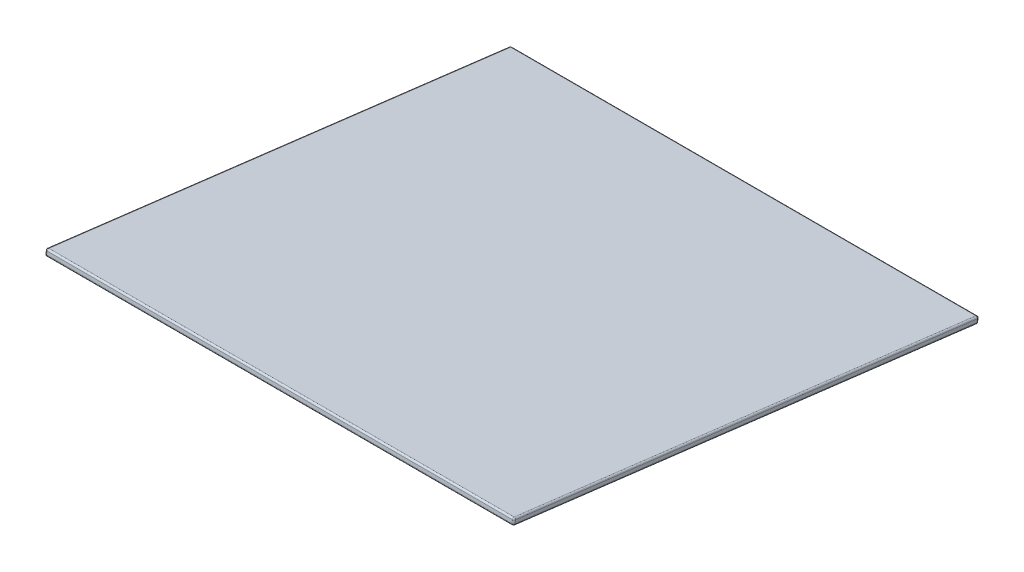
ISO-10303-21;
HEADER;
FILE_DESCRIPTION(('STEP AP214'),'2;1');
FILE_NAME('part.step','',(''),(''),'','','');
FILE_SCHEMA(('AUTOMOTIVE_DESIGN { 1 0 10303 214 1 1 1 1 }'));
ENDSEC;
DATA;
#1=APPLICATION_CONTEXT('core data for automotive mechanical design processes');
#2=APPLICATION_PROTOCOL_DEFINITION('international standard','automotive_design',2000,#1);
#3=PRODUCT_CONTEXT('',#1,'mechanical');
#4=PRODUCT('Part','Part','',(#3));
#5=PRODUCT_RELATED_PRODUCT_CATEGORY('part','',(#4));
#6=PRODUCT_DEFINITION_FORMATION('','',#4);
#7=PRODUCT_DEFINITION_CONTEXT('part definition',#1,'design');
#8=PRODUCT_DEFINITION('design','',#6,#7);
#9=PRODUCT_DEFINITION_SHAPE('','',#8);
#10=(LENGTH_UNIT() NAMED_UNIT(*) SI_UNIT(.MILLI.,.METRE.));
#11=(NAMED_UNIT(*) PLANE_ANGLE_UNIT() SI_UNIT($,.RADIAN.));
#12=(NAMED_UNIT(*) SI_UNIT($,.STERADIAN.) SOLID_ANGLE_UNIT());
#13=UNCERTAINTY_MEASURE_WITH_UNIT(LENGTH_MEASURE(1.E-05),#10,'distance_accuracy_value','');
#14=(GEOMETRIC_REPRESENTATION_CONTEXT(3) GLOBAL_UNCERTAINTY_ASSIGNED_CONTEXT((#13)) GLOBAL_UNIT_ASSIGNED_CONTEXT((#10,
#11,#12)) REPRESENTATION_CONTEXT('',''));
#15=CARTESIAN_POINT('',(0.,0.,0.));
#16=DIRECTION('',(0.,0.,1.));
#17=DIRECTION('',(1.,0.,0.));
#18=AXIS2_PLACEMENT_3D('',#15,#16,#17);
#19=CARTESIAN_POINT('',(72.5,-11.5000570562289,-71.6324328897591));
#20=DIRECTION('',(1.,0.,0.));
#21=DIRECTION('',(0.,0.,-1.));
#22=AXIS2_PLACEMENT_3D('',#19,#20,#21);
#23=PLANE('',#22);
#24=DIRECTION('',(0.,-0.992546151641323,0.121869343405141));
#25=VECTOR('',#24,1.);
#26=CARTESIAN_POINT('',(72.5,-11.4391223845263,-71.1361598139385));
#27=LINE('',#26,#25);
#28=CARTESIAN_POINT('',(72.5,-12.9279416119883,-70.9533557988308));
#29=VERTEX_POINT('',#28);
#30=CARTESIAN_POINT('',(72.5,-11.935395460347,-71.0752251422359));
#31=VERTEX_POINT('',#30);
#32=EDGE_CURVE('E219',#29,#31,#27,.F.);
#33=ORIENTED_EDGE('',*,*,#32,.T.);
#34=DIRECTION('',(0.,0.121869343405141,0.992546151641323));
#35=VECTOR('',#34,1.);
#36=CARTESIAN_POINT('',(72.5,5.67472466169586,72.3476937699352));
#37=LINE('',#36,#35);
#38=CARTESIAN_POINT('',(72.5,5.61378998999329,71.8514206941146));
#39=VERTEX_POINT('',#38);
#40=EDGE_CURVE('E222',#31,#39,#37,.T.);
#41=ORIENTED_EDGE('',*,*,#40,.T.);
#42=DIRECTION('',(0.,-0.992546151641323,0.121869343405141));
#43=VECTOR('',#42,1.);
#44=CARTESIAN_POINT('',(72.5,6.11006306581395,71.790486022412));
#45=LINE('',#44,#43);
#46=CARTESIAN_POINT('',(72.5,4.62124383835196,71.9732900375197));
#47=VERTEX_POINT('',#46);
#48=EDGE_CURVE('E220',#39,#47,#45,.T.);
#49=ORIENTED_EDGE('',*,*,#48,.T.);
#50=DIRECTION('',(0.,0.121869343405141,0.992546151641323));
#51=VECTOR('',#50,1.);
#52=CARTESIAN_POINT('',(72.5,-12.9888762836909,-71.4496288746514));
#53=LINE('',#52,#51);
#54=EDGE_CURVE('E216',#47,#29,#53,.F.);
#55=ORIENTED_EDGE('',*,*,#54,.T.);
#56=EDGE_LOOP('',(#33,#41,#49,#55));
#57=FACE_BOUND('',#56,.T.);
#58=ADVANCED_FACE('F37',(#57),#23,.T.);
#59=CARTESIAN_POINT('',(72.5,-11.5000570562289,-71.6324328897591));
#60=DIRECTION('',(0.,0.121869343405141,0.992546151641323));
#61=DIRECTION('',(0.,-0.992546151641323,0.121869343405141));
#62=AXIS2_PLACEMENT_3D('',#59,#60,#61);
#63=PLANE('',#62);
#64=DIRECTION('',(-1.,0.,0.));
#65=VECTOR('',#64,1.);
#66=CARTESIAN_POINT('',(72.5,-11.9963301320496,-71.5714982180566));
#67=LINE('',#66,#65);
#68=CARTESIAN_POINT('',(-72.,-11.9963301320496,-71.5714982180566));
#69=VERTEX_POINT('',#68);
#70=CARTESIAN_POINT('',(72.,-11.9963301320496,-71.5714982180566));
#71=VERTEX_POINT('',#70);
#72=EDGE_CURVE('E269',#69,#71,#67,.F.);
#73=ORIENTED_EDGE('',*,*,#72,.T.);
#74=DIRECTION('',(0.,-0.992546151641323,0.121869343405141));
#75=VECTOR('',#74,1.);
#76=CARTESIAN_POINT('',(72.,-13.4851493595115,-71.3886942029489));
#77=LINE('',#76,#75);
#78=CARTESIAN_POINT('',(72.,-12.9888762836909,-71.4496288746514));
#79=VERTEX_POINT('',#78);
#80=EDGE_CURVE('E263',#71,#79,#77,.T.);
#81=ORIENTED_EDGE('',*,*,#80,.T.);
#82=DIRECTION('',(-1.,0.,0.));
#83=VECTOR('',#82,1.);
#84=CARTESIAN_POINT('',(-72.5,-12.9888762836909,-71.4496288746514));
#85=LINE('',#84,#83);
#86=CARTESIAN_POINT('',(-72.,-12.9888762836909,-71.4496288746514));
#87=VERTEX_POINT('',#86);
#88=EDGE_CURVE('E278',#79,#87,#85,.T.);
#89=ORIENTED_EDGE('',*,*,#88,.T.);
#90=DIRECTION('',(0.,-0.992546151641323,0.121869343405141));
#91=VECTOR('',#90,1.);
#92=CARTESIAN_POINT('',(-72.,-11.5000570562289,-71.6324328897591));
#93=LINE('',#92,#91);
#94=EDGE_CURVE('E274',#87,#69,#93,.F.);
#95=ORIENTED_EDGE('',*,*,#94,.T.);
#96=EDGE_LOOP('',(#73,#81,#89,#95));
#97=FACE_BOUND('',#96,.T.);
#98=ADVANCED_FACE('F272',(#97),#63,.F.);
#99=CARTESIAN_POINT('',(-72.5,-11.5000570562289,-71.6324328897591));
#100=DIRECTION('',(1.,0.,0.));
#101=DIRECTION('',(0.,0.,-1.));
#102=AXIS2_PLACEMENT_3D('',#99,#100,#101);
#103=PLANE('',#102);
#104=DIRECTION('',(0.,0.121869343405141,0.992546151641323));
#105=VECTOR('',#104,1.);
#106=CARTESIAN_POINT('',(-72.5,-11.9963301320496,-71.5714982180566));
#107=LINE('',#106,#105);
#108=CARTESIAN_POINT('',(-72.5,5.61378998999329,71.8514206941146));
#109=VERTEX_POINT('',#108);
#110=CARTESIAN_POINT('',(-72.5,-11.935395460347,-71.0752251422359));
#111=VERTEX_POINT('',#110);
#112=EDGE_CURVE('E156',#109,#111,#107,.F.);
#113=ORIENTED_EDGE('',*,*,#112,.T.);
#114=DIRECTION('',(0.,-0.992546151641323,0.121869343405141));
#115=VECTOR('',#114,1.);
#116=CARTESIAN_POINT('',(-72.5,-11.4391223845263,-71.1361598139385));
#117=LINE('',#116,#115);
#118=CARTESIAN_POINT('',(-72.5,-12.9279416119883,-70.9533557988307));
#119=VERTEX_POINT('',#118);
#120=EDGE_CURVE('E235',#111,#119,#117,.T.);
#121=ORIENTED_EDGE('',*,*,#120,.T.);
#122=DIRECTION('',(0.,0.121869343405141,0.992546151641323));
#123=VECTOR('',#122,1.);
#124=CARTESIAN_POINT('',(-72.5,4.68217851005454,72.4695631133404));
#125=LINE('',#124,#123);
#126=CARTESIAN_POINT('',(-72.5,4.62124383835197,71.9732900375198));
#127=VERTEX_POINT('',#126);
#128=EDGE_CURVE('E232',#119,#127,#125,.T.);
#129=ORIENTED_EDGE('',*,*,#128,.T.);
#130=DIRECTION('',(0.,-0.992546151641323,0.121869343405141));
#131=VECTOR('',#130,1.);
#132=CARTESIAN_POINT('',(-72.5,6.11006306581395,71.790486022412));
#133=LINE('',#132,#131);
#134=EDGE_CURVE('E230',#127,#109,#133,.F.);
#135=ORIENTED_EDGE('',*,*,#134,.T.);
#136=EDGE_LOOP('',(#113,#121,#129,#135));
#137=FACE_BOUND('',#136,.T.);
#138=ADVANCED_FACE('F331',(#137),#103,.F.);
#139=CARTESIAN_POINT('',(72.5,6.17099773751652,72.2867590982327));
#140=DIRECTION('',(0.,0.121869343405141,0.992546151641323));
#141=DIRECTION('',(0.,-0.992546151641323,0.121869343405141));
#142=AXIS2_PLACEMENT_3D('',#139,#140,#141);
#143=PLANE('',#142);
#144=DIRECTION('',(-1.,0.,0.));
#145=VECTOR('',#144,1.);
#146=CARTESIAN_POINT('',(-72.5,5.67472466169586,72.3476937699353));
#147=LINE('',#146,#145);
#148=CARTESIAN_POINT('',(72.,5.67472466169586,72.3476937699352));
#149=VERTEX_POINT('',#148);
#150=CARTESIAN_POINT('',(-72.,5.67472466169586,72.3476937699353));
#151=VERTEX_POINT('',#150);
#152=EDGE_CURVE('E46',#149,#151,#147,.T.);
#153=ORIENTED_EDGE('',*,*,#152,.T.);
#154=DIRECTION('',(0.,-0.992546151641323,0.121869343405141));
#155=VECTOR('',#154,1.);
#156=CARTESIAN_POINT('',(-72.,4.18590543423387,72.530497785043));
#157=LINE('',#156,#155);
#158=CARTESIAN_POINT('',(-72.,4.68217851005454,72.4695631133404));
#159=VERTEX_POINT('',#158);
#160=EDGE_CURVE('E11',#151,#159,#157,.T.);
#161=ORIENTED_EDGE('',*,*,#160,.T.);
#162=DIRECTION('',(-1.,0.,0.));
#163=VECTOR('',#162,1.);
#164=CARTESIAN_POINT('',(72.5,4.68217851005453,72.4695631133404));
#165=LINE('',#164,#163);
#166=CARTESIAN_POINT('',(72.,4.68217851005453,72.4695631133404));
#167=VERTEX_POINT('',#166);
#168=EDGE_CURVE('E238',#159,#167,#165,.F.);
#169=ORIENTED_EDGE('',*,*,#168,.T.);
#170=DIRECTION('',(0.,-0.992546151641323,0.121869343405141));
#171=VECTOR('',#170,1.);
#172=CARTESIAN_POINT('',(72.,6.17099773751652,72.2867590982327));
#173=LINE('',#172,#171);
#174=EDGE_CURVE('E57',#167,#149,#173,.F.);
#175=ORIENTED_EDGE('',*,*,#174,.T.);
#176=EDGE_LOOP('',(#153,#161,#169,#175));
#177=FACE_BOUND('',#176,.T.);
#178=ADVANCED_FACE('F335',(#177),#143,.T.);
#179=CARTESIAN_POINT('',(0.,-2.66452965935618,0.327163104236797));
#180=DIRECTION('',(0.,-0.992546151641323,0.121869343405141));
#181=DIRECTION('',(0.,-0.121869343405141,-0.992546151641323));
#182=AXIS2_PLACEMENT_3D('',#179,#180,#181);
#183=PLANE('',#182);
#184=DIRECTION('',(0.,0.121869343405141,0.992546151641323));
#185=VECTOR('',#184,1.);
#186=CARTESIAN_POINT('',(72.,-11.5000570562289,-71.6324328897591));
#187=LINE('',#186,#185);
#188=CARTESIAN_POINT('',(72.,6.11006306581395,71.790486022412));
#189=VERTEX_POINT('',#188);
#190=CARTESIAN_POINT('',(72.,-11.4391223845263,-71.1361598139385));
#191=VERTEX_POINT('',#190);
#192=EDGE_CURVE('E135',#189,#191,#187,.F.);
#193=ORIENTED_EDGE('',*,*,#192,.T.);
#194=DIRECTION('',(-1.,0.,0.));
#195=VECTOR('',#194,1.);
#196=CARTESIAN_POINT('',(0.,-11.4391223845263,-71.1361598139385));
#197=LINE('',#196,#195);
#198=CARTESIAN_POINT('',(-72.,-11.4391223845263,-71.1361598139385));
#199=VERTEX_POINT('',#198);
#200=EDGE_CURVE('E131',#191,#199,#197,.T.);
#201=ORIENTED_EDGE('',*,*,#200,.T.);
#202=DIRECTION('',(0.,0.121869343405141,0.992546151641323));
#203=VECTOR('',#202,1.);
#204=CARTESIAN_POINT('',(-72.,-2.66452965935618,0.327163104236803));
#205=LINE('',#204,#203);
#206=CARTESIAN_POINT('',(-72.,6.11006306581395,71.790486022412));
#207=VERTEX_POINT('',#206);
#208=EDGE_CURVE('E125',#199,#207,#205,.T.);
#209=ORIENTED_EDGE('',*,*,#208,.T.);
#210=DIRECTION('',(-1.,0.,0.));
#211=VECTOR('',#210,1.);
#212=CARTESIAN_POINT('',(72.5,6.11006306581395,71.790486022412));
#213=LINE('',#212,#211);
#214=EDGE_CURVE('E128',#207,#189,#213,.F.);
#215=ORIENTED_EDGE('',*,*,#214,.T.);
#216=EDGE_LOOP('',(#193,#201,#209,#215));
#217=FACE_BOUND('',#216,.T.);
#218=ADVANCED_FACE('F127',(#217),#183,.F.);
#219=CARTESIAN_POINT('',(0.,-4.64962196263883,0.570901791047078));
#220=DIRECTION('',(0.,-0.992546151641323,0.121869343405141));
#221=DIRECTION('',(0.,-0.121869343405141,-0.992546151641323));
#222=AXIS2_PLACEMENT_3D('',#219,#220,#221);
#223=PLANE('',#222);
#224=DIRECTION('',(0.,0.121869343405141,0.992546151641323));
#225=VECTOR('',#224,1.);
#226=CARTESIAN_POINT('',(-72.,-13.4851493595115,-71.3886942029488));
#227=LINE('',#226,#225);
#228=CARTESIAN_POINT('',(-72.,4.12497076253131,72.0342247092223));
#229=VERTEX_POINT('',#228);
#230=CARTESIAN_POINT('',(-72.,-13.424214687809,-70.8924211271282));
#231=VERTEX_POINT('',#230);
#232=EDGE_CURVE('E284',#229,#231,#227,.F.);
#233=ORIENTED_EDGE('',*,*,#232,.T.);
#234=DIRECTION('',(-1.,0.,0.));
#235=VECTOR('',#234,1.);
#236=CARTESIAN_POINT('',(72.5,-13.424214687809,-70.8924211271282));
#237=LINE('',#236,#235);
#238=CARTESIAN_POINT('',(72.,-13.424214687809,-70.8924211271282));
#239=VERTEX_POINT('',#238);
#240=EDGE_CURVE('E224',#231,#239,#237,.F.);
#241=ORIENTED_EDGE('',*,*,#240,.T.);
#242=DIRECTION('',(0.,0.121869343405141,0.992546151641323));
#243=VECTOR('',#242,1.);
#244=CARTESIAN_POINT('',(72.,-4.64962196263883,0.570901791047071));
#245=LINE('',#244,#243);
#246=CARTESIAN_POINT('',(72.,4.1249707625313,72.0342247092223));
#247=VERTEX_POINT('',#246);
#248=EDGE_CURVE('E214',#239,#247,#245,.T.);
#249=ORIENTED_EDGE('',*,*,#248,.T.);
#250=DIRECTION('',(-1.,0.,0.));
#251=VECTOR('',#250,1.);
#252=CARTESIAN_POINT('',(0.,4.1249707625313,72.0342247092223));
#253=LINE('',#252,#251);
#254=EDGE_CURVE('E268',#247,#229,#253,.T.);
#255=ORIENTED_EDGE('',*,*,#254,.T.);
#256=EDGE_LOOP('',(#233,#241,#249,#255));
#257=FACE_BOUND('',#256,.T.);
#258=ADVANCED_FACE('F288',(#257),#223,.T.);
#259=CARTESIAN_POINT('',(0.,4.62124383835197,71.9732900375197));
#260=DIRECTION('',(-1.,0.,0.));
#261=DIRECTION('',(0.,0.,1.));
#262=AXIS2_PLACEMENT_3D('',#259,#260,#261);
#263=CYLINDRICAL_SURFACE('',#262,0.5);
#264=CARTESIAN_POINT('',(72.,4.62124383835196,71.9732900375197));
#265=DIRECTION('',(1.,0.,0.));
#266=DIRECTION('',(0.,1.,0.));
#267=AXIS2_PLACEMENT_3D('',#264,#265,#266);
#268=CIRCLE('',#267,0.5);
#269=EDGE_CURVE('E41',#167,#247,#268,.T.);
#270=ORIENTED_EDGE('',*,*,#269,.F.);
#271=ORIENTED_EDGE('',*,*,#168,.F.);
#272=CARTESIAN_POINT('',(-72.,4.62124383835197,71.9732900375198));
#273=DIRECTION('',(-1.,0.,0.));
#274=DIRECTION('',(0.,0.,1.));
#275=AXIS2_PLACEMENT_3D('',#272,#273,#274);
#276=CIRCLE('',#275,0.5);
#277=EDGE_CURVE('E194',#229,#159,#276,.T.);
#278=ORIENTED_EDGE('',*,*,#277,.F.);
#279=ORIENTED_EDGE('',*,*,#254,.F.);
#280=EDGE_LOOP('',(#270,#271,#278,#279));
#281=FACE_BOUND('',#280,.T.);
#282=ADVANCED_FACE('F39',(#281),#263,.T.);
#283=CARTESIAN_POINT('',(72.,4.62124383835196,71.9732900375197));
#284=DIRECTION('',(0.,-0.992546151641324,0.121869343405135));
#285=DIRECTION('',(0.,-0.121869343405135,-0.992546151641324));
#286=AXIS2_PLACEMENT_3D('',#283,#284,#285);
#287=SPHERICAL_SURFACE('',#286,0.5);
#288=CARTESIAN_POINT('',(72.,4.62124383835196,71.9732900375197));
#289=DIRECTION('',(0.,-0.992546151641323,0.121869343405138));
#290=DIRECTION('',(0.,-0.121869343405138,-0.992546151641323));
#291=AXIS2_PLACEMENT_3D('',#288,#289,#290);
#292=CIRCLE('',#291,0.5);
#293=EDGE_CURVE('E189',#167,#47,#292,.F.);
#294=ORIENTED_EDGE('',*,*,#293,.F.);
#295=ORIENTED_EDGE('',*,*,#269,.T.);
#296=CARTESIAN_POINT('',(72.,4.62124383835196,71.9732900375197));
#297=DIRECTION('',(0.,0.121869343405134,0.992546151641324));
#298=DIRECTION('',(0.,-0.992546151641324,0.121869343405134));
#299=AXIS2_PLACEMENT_3D('',#296,#297,#298);
#300=CIRCLE('',#299,0.5);
#301=EDGE_CURVE('E192',#47,#247,#300,.F.);
#302=ORIENTED_EDGE('',*,*,#301,.F.);
#303=EDGE_LOOP('',(#294,#295,#302));
#304=FACE_BOUND('',#303,.T.);
#305=ADVANCED_FACE('F206',(#304),#287,.T.);
#306=CARTESIAN_POINT('',(-72.,4.62124383835197,71.9732900375198));
#307=DIRECTION('',(0.,0.121869343405136,0.992546151641323));
#308=DIRECTION('',(0.,-0.992546151641324,0.121869343405136));
#309=AXIS2_PLACEMENT_3D('',#306,#307,#308);
#310=SPHERICAL_SURFACE('',#309,0.5);
#311=CARTESIAN_POINT('',(-72.,4.62124383835197,71.9732900375198));
#312=DIRECTION('',(0.,0.121869343405134,0.992546151641324));
#313=DIRECTION('',(0.,-0.992546151641324,0.121869343405134));
#314=AXIS2_PLACEMENT_3D('',#311,#312,#313);
#315=CIRCLE('',#314,0.5);
#316=EDGE_CURVE('E184',#229,#127,#315,.F.);
#317=ORIENTED_EDGE('',*,*,#316,.F.);
#318=ORIENTED_EDGE('',*,*,#277,.T.);
#319=CARTESIAN_POINT('',(-72.,4.62124383835196,71.9732900375198));
#320=DIRECTION('',(0.,-0.992546151641323,0.121869343405141));
#321=DIRECTION('',(0.,-0.121869343405141,-0.992546151641323));
#322=AXIS2_PLACEMENT_3D('',#319,#320,#321);
#323=CIRCLE('',#322,0.5);
#324=EDGE_CURVE('E187',#127,#159,#323,.F.);
#325=ORIENTED_EDGE('',*,*,#324,.F.);
#326=EDGE_LOOP('',(#317,#318,#325));
#327=FACE_BOUND('',#326,.T.);
#328=ADVANCED_FACE('F494',(#327),#310,.T.);
#329=CARTESIAN_POINT('',(72.,-4.15334888681817,0.509967119344501));
#330=DIRECTION('',(0.,0.121869343405141,0.992546151641323));
#331=DIRECTION('',(0.,-0.992546151641323,0.121869343405141));
#332=AXIS2_PLACEMENT_3D('',#329,#330,#331);
#333=CYLINDRICAL_SURFACE('',#332,0.5);
#334=ORIENTED_EDGE('',*,*,#301,.T.);
#335=ORIENTED_EDGE('',*,*,#248,.F.);
#336=CARTESIAN_POINT('',(72.,-12.9279416119883,-70.9533557988308));
#337=DIRECTION('',(0.,-0.121869343405135,-0.992546151641324));
#338=DIRECTION('',(0.,0.992546151641324,-0.121869343405135));
#339=AXIS2_PLACEMENT_3D('',#336,#337,#338);
#340=CIRCLE('',#339,0.5);
#341=EDGE_CURVE('E179',#29,#239,#340,.T.);
#342=ORIENTED_EDGE('',*,*,#341,.F.);
#343=ORIENTED_EDGE('',*,*,#54,.F.);
#344=EDGE_LOOP('',(#334,#335,#342,#343));
#345=FACE_BOUND('',#344,.T.);
#346=ADVANCED_FACE('F212',(#345),#333,.T.);
#347=CARTESIAN_POINT('',(72.,6.11006306581395,71.790486022412));
#348=DIRECTION('',(0.,-0.992546151641323,0.121869343405141));
#349=DIRECTION('',(0.,-0.121869343405141,-0.992546151641323));
#350=AXIS2_PLACEMENT_3D('',#347,#348,#349);
#351=CYLINDRICAL_SURFACE('',#350,0.5);
#352=ORIENTED_EDGE('',*,*,#293,.T.);
#353=ORIENTED_EDGE('',*,*,#48,.F.);
#354=CARTESIAN_POINT('',(72.,5.61378998999329,71.8514206941146));
#355=DIRECTION('',(0.,0.992546151641323,-0.121869343405141));
#356=DIRECTION('',(0.,0.121869343405141,0.992546151641323));
#357=AXIS2_PLACEMENT_3D('',#354,#355,#356);
#358=CIRCLE('',#357,0.5);
#359=EDGE_CURVE('E176',#149,#39,#358,.T.);
#360=ORIENTED_EDGE('',*,*,#359,.F.);
#361=ORIENTED_EDGE('',*,*,#174,.F.);
#362=EDGE_LOOP('',(#352,#353,#360,#361));
#363=FACE_BOUND('',#362,.T.);
#364=ADVANCED_FACE('F313',(#363),#351,.T.);
#365=CARTESIAN_POINT('',(72.5,5.61378998999329,71.8514206941146));
#366=DIRECTION('',(1.,0.,0.));
#367=DIRECTION('',(0.,0.,-1.));
#368=AXIS2_PLACEMENT_3D('',#365,#366,#367);
#369=CYLINDRICAL_SURFACE('',#368,0.5);
#370=CARTESIAN_POINT('',(-72.,5.61378998999329,71.8514206941146));
#371=DIRECTION('',(-1.,0.,0.));
#372=DIRECTION('',(0.,-1.,0.));
#373=AXIS2_PLACEMENT_3D('',#370,#371,#372);
#374=CIRCLE('',#373,0.5);
#375=EDGE_CURVE('E141',#151,#207,#374,.T.);
#376=ORIENTED_EDGE('',*,*,#375,.F.);
#377=ORIENTED_EDGE('',*,*,#152,.F.);
#378=CARTESIAN_POINT('',(72.,5.61378998999329,71.8514206941146));
#379=DIRECTION('',(1.,0.,0.));
#380=DIRECTION('',(0.,0.,-1.));
#381=AXIS2_PLACEMENT_3D('',#378,#379,#380);
#382=CIRCLE('',#381,0.5);
#383=EDGE_CURVE('E144',#189,#149,#382,.T.);
#384=ORIENTED_EDGE('',*,*,#383,.F.);
#385=ORIENTED_EDGE('',*,*,#214,.F.);
#386=EDGE_LOOP('',(#376,#377,#384,#385));
#387=FACE_BOUND('',#386,.T.);
#388=ADVANCED_FACE('F140',(#387),#369,.T.);
#389=CARTESIAN_POINT('',(-72.,6.11006306581395,71.790486022412));
#390=DIRECTION('',(0.,0.992546151641323,-0.121869343405141));
#391=DIRECTION('',(0.,0.121869343405141,0.992546151641323));
#392=AXIS2_PLACEMENT_3D('',#389,#390,#391);
#393=CYLINDRICAL_SURFACE('',#392,0.5);
#394=ORIENTED_EDGE('',*,*,#324,.T.);
#395=ORIENTED_EDGE('',*,*,#160,.F.);
#396=CARTESIAN_POINT('',(-72.,5.61378998999329,71.8514206941146));
#397=DIRECTION('',(0.,0.992546151641323,-0.12186934340514));
#398=DIRECTION('',(0.,0.12186934340514,0.992546151641323));
#399=AXIS2_PLACEMENT_3D('',#396,#397,#398);
#400=CIRCLE('',#399,0.5);
#401=EDGE_CURVE('E153',#109,#151,#400,.T.);
#402=ORIENTED_EDGE('',*,*,#401,.F.);
#403=ORIENTED_EDGE('',*,*,#134,.F.);
#404=EDGE_LOOP('',(#394,#395,#402,#403));
#405=FACE_BOUND('',#404,.T.);
#406=ADVANCED_FACE('F456',(#405),#393,.T.);
#407=CARTESIAN_POINT('',(-72.,-12.9888762836909,-71.4496288746514));
#408=DIRECTION('',(0.,-0.121869343405141,-0.992546151641323));
#409=DIRECTION('',(0.,0.992546151641323,-0.121869343405141));
#410=AXIS2_PLACEMENT_3D('',#407,#408,#409);
#411=CYLINDRICAL_SURFACE('',#410,0.5);
#412=ORIENTED_EDGE('',*,*,#316,.T.);
#413=ORIENTED_EDGE('',*,*,#128,.F.);
#414=CARTESIAN_POINT('',(-72.,-12.9279416119883,-70.9533557988307));
#415=DIRECTION('',(0.,-0.121869343405135,-0.992546151641324));
#416=DIRECTION('',(0.,0.992546151641324,-0.121869343405135));
#417=AXIS2_PLACEMENT_3D('',#414,#415,#416);
#418=CIRCLE('',#417,0.5);
#419=EDGE_CURVE('E171',#231,#119,#418,.T.);
#420=ORIENTED_EDGE('',*,*,#419,.F.);
#421=ORIENTED_EDGE('',*,*,#232,.F.);
#422=EDGE_LOOP('',(#412,#413,#420,#421));
#423=FACE_BOUND('',#422,.T.);
#424=ADVANCED_FACE('F298',(#423),#411,.T.);
#425=CARTESIAN_POINT('',(72.5,-12.9279416119883,-70.9533557988308));
#426=DIRECTION('',(1.,0.,0.));
#427=DIRECTION('',(0.,0.,-1.));
#428=AXIS2_PLACEMENT_3D('',#425,#426,#427);
#429=CYLINDRICAL_SURFACE('',#428,0.5);
#430=CARTESIAN_POINT('',(72.,-12.9279416119883,-70.9533557988308));
#431=DIRECTION('',(1.,0.,0.));
#432=DIRECTION('',(0.,0.,-1.));
#433=AXIS2_PLACEMENT_3D('',#430,#431,#432);
#434=CIRCLE('',#433,0.5);
#435=EDGE_CURVE('E181',#239,#79,#434,.T.);
#436=ORIENTED_EDGE('',*,*,#435,.F.);
#437=ORIENTED_EDGE('',*,*,#240,.F.);
#438=CARTESIAN_POINT('',(-72.,-12.9279416119883,-70.9533557988307));
#439=DIRECTION('',(-1.,0.,0.));
#440=DIRECTION('',(0.,0.,1.));
#441=AXIS2_PLACEMENT_3D('',#438,#439,#440);
#442=CIRCLE('',#441,0.5);
#443=EDGE_CURVE('E168',#87,#231,#442,.T.);
#444=ORIENTED_EDGE('',*,*,#443,.F.);
#445=ORIENTED_EDGE('',*,*,#88,.F.);
#446=EDGE_LOOP('',(#436,#437,#444,#445));
#447=FACE_BOUND('',#446,.T.);
#448=ADVANCED_FACE('F294',(#447),#429,.T.);
#449=CARTESIAN_POINT('',(72.,-12.9279416119883,-70.9533557988308));
#450=DIRECTION('',(0.,-0.992546151641324,0.121869343405134));
#451=DIRECTION('',(0.,-0.121869343405134,-0.992546151641324));
#452=AXIS2_PLACEMENT_3D('',#449,#450,#451);
#453=SPHERICAL_SURFACE('',#452,0.5);
#454=ORIENTED_EDGE('',*,*,#341,.T.);
#455=ORIENTED_EDGE('',*,*,#435,.T.);
#456=CARTESIAN_POINT('',(72.,-12.9279416119883,-70.9533557988308));
#457=DIRECTION('',(0.,-0.992546151641323,0.121869343405141));
#458=DIRECTION('',(0.,-0.121869343405141,-0.992546151641323));
#459=AXIS2_PLACEMENT_3D('',#456,#457,#458);
#460=CIRCLE('',#459,0.5);
#461=EDGE_CURVE('E160',#29,#79,#460,.F.);
#462=ORIENTED_EDGE('',*,*,#461,.F.);
#463=EDGE_LOOP('',(#454,#455,#462));
#464=FACE_BOUND('',#463,.T.);
#465=ADVANCED_FACE('F317',(#464),#453,.T.);
#466=CARTESIAN_POINT('',(72.,5.61378998999329,71.8514206941146));
#467=DIRECTION('',(0.,0.121869343405141,0.992546151641323));
#468=DIRECTION('',(0.,-0.992546151641323,0.121869343405141));
#469=AXIS2_PLACEMENT_3D('',#466,#467,#468);
#470=SPHERICAL_SURFACE('',#469,0.5);
#471=ORIENTED_EDGE('',*,*,#383,.T.);
#472=ORIENTED_EDGE('',*,*,#359,.T.);
#473=CARTESIAN_POINT('',(72.,5.61378998999329,71.8514206941146));
#474=DIRECTION('',(0.,0.121869343405162,0.99254615164132));
#475=DIRECTION('',(0.,-0.99254615164132,0.121869343405162));
#476=AXIS2_PLACEMENT_3D('',#473,#474,#475);
#477=CIRCLE('',#476,0.5);
#478=EDGE_CURVE('E157',#189,#39,#477,.F.);
#479=ORIENTED_EDGE('',*,*,#478,.F.);
#480=EDGE_LOOP('',(#471,#472,#479));
#481=FACE_BOUND('',#480,.T.);
#482=ADVANCED_FACE('F315',(#481),#470,.T.);
#483=CARTESIAN_POINT('',(-72.,5.61378998999329,71.8514206941146));
#484=DIRECTION('',(0.,0.121869343405143,0.992546151641322));
#485=DIRECTION('',(0.,-0.992546151641323,0.121869343405143));
#486=AXIS2_PLACEMENT_3D('',#483,#484,#485);
#487=SPHERICAL_SURFACE('',#486,0.5);
#488=ORIENTED_EDGE('',*,*,#401,.T.);
#489=ORIENTED_EDGE('',*,*,#375,.T.);
#490=CARTESIAN_POINT('',(-72.,5.61378998999329,71.8514206941146));
#491=DIRECTION('',(0.,0.121869343405134,0.992546151641323));
#492=DIRECTION('',(0.,-0.992546151641324,0.121869343405134));
#493=AXIS2_PLACEMENT_3D('',#490,#491,#492);
#494=CIRCLE('',#493,0.5);
#495=EDGE_CURVE('E150',#109,#207,#494,.F.);
#496=ORIENTED_EDGE('',*,*,#495,.F.);
#497=EDGE_LOOP('',(#488,#489,#496));
#498=FACE_BOUND('',#497,.T.);
#499=ADVANCED_FACE('F149',(#498),#487,.T.);
#500=CARTESIAN_POINT('',(-72.,-12.9279416119883,-70.9533557988307));
#501=DIRECTION('',(0.,-0.992546151641324,0.121869343405135));
#502=DIRECTION('',(0.,-0.121869343405135,-0.992546151641324));
#503=AXIS2_PLACEMENT_3D('',#500,#501,#502);
#504=SPHERICAL_SURFACE('',#503,0.5);
#505=ORIENTED_EDGE('',*,*,#443,.T.);
#506=ORIENTED_EDGE('',*,*,#419,.T.);
#507=CARTESIAN_POINT('',(-72.,-12.9279416119883,-70.9533557988307));
#508=DIRECTION('',(0.,-0.992546151641322,0.121869343405145));
#509=DIRECTION('',(0.,-0.121869343405145,-0.992546151641322));
#510=AXIS2_PLACEMENT_3D('',#507,#508,#509);
#511=CIRCLE('',#510,0.5);
#512=EDGE_CURVE('E158',#87,#119,#511,.F.);
#513=ORIENTED_EDGE('',*,*,#512,.F.);
#514=EDGE_LOOP('',(#505,#506,#513));
#515=FACE_BOUND('',#514,.T.);
#516=ADVANCED_FACE('F300',(#515),#504,.T.);
#517=CARTESIAN_POINT('',(72.,-11.4391223845263,-71.1361598139385));
#518=DIRECTION('',(0.,0.992546151641323,-0.121869343405141));
#519=DIRECTION('',(0.,0.121869343405141,0.992546151641323));
#520=AXIS2_PLACEMENT_3D('',#517,#518,#519);
#521=CYLINDRICAL_SURFACE('',#520,0.5);
#522=ORIENTED_EDGE('',*,*,#461,.T.);
#523=ORIENTED_EDGE('',*,*,#80,.F.);
#524=CARTESIAN_POINT('',(72.,-11.935395460347,-71.0752251422359));
#525=DIRECTION('',(0.,0.992546151641322,-0.121869343405145));
#526=DIRECTION('',(0.,0.121869343405145,0.992546151641322));
#527=AXIS2_PLACEMENT_3D('',#524,#525,#526);
#528=CIRCLE('',#527,0.5);
#529=EDGE_CURVE('E162',#31,#71,#528,.T.);
#530=ORIENTED_EDGE('',*,*,#529,.F.);
#531=ORIENTED_EDGE('',*,*,#32,.F.);
#532=EDGE_LOOP('',(#522,#523,#530,#531));
#533=FACE_BOUND('',#532,.T.);
#534=ADVANCED_FACE('F265',(#533),#521,.T.);
#535=CARTESIAN_POINT('',(72.,-11.9963301320496,-71.5714982180566));
#536=DIRECTION('',(0.,-0.121869343405141,-0.992546151641323));
#537=DIRECTION('',(0.,0.992546151641323,-0.121869343405141));
#538=AXIS2_PLACEMENT_3D('',#535,#536,#537);
#539=CYLINDRICAL_SURFACE('',#538,0.5);
#540=ORIENTED_EDGE('',*,*,#478,.T.);
#541=ORIENTED_EDGE('',*,*,#40,.F.);
#542=CARTESIAN_POINT('',(72.,-11.935395460347,-71.0752251422359));
#543=DIRECTION('',(0.,-0.121869343405135,-0.992546151641324));
#544=DIRECTION('',(0.,0.992546151641324,-0.121869343405135));
#545=AXIS2_PLACEMENT_3D('',#542,#543,#544);
#546=CIRCLE('',#545,0.5);
#547=EDGE_CURVE('E252',#191,#31,#546,.T.);
#548=ORIENTED_EDGE('',*,*,#547,.F.);
#549=ORIENTED_EDGE('',*,*,#192,.F.);
#550=EDGE_LOOP('',(#540,#541,#548,#549));
#551=FACE_BOUND('',#550,.T.);
#552=ADVANCED_FACE('F309',(#551),#539,.T.);
#553=CARTESIAN_POINT('',(-72.,-3.16080273517684,0.388097775939374));
#554=DIRECTION('',(0.,0.121869343405141,0.992546151641323));
#555=DIRECTION('',(0.,-0.992546151641323,0.121869343405141));
#556=AXIS2_PLACEMENT_3D('',#553,#554,#555);
#557=CYLINDRICAL_SURFACE('',#556,0.5);
#558=ORIENTED_EDGE('',*,*,#495,.T.);
#559=ORIENTED_EDGE('',*,*,#208,.F.);
#560=CARTESIAN_POINT('',(-72.,-11.935395460347,-71.0752251422359));
#561=DIRECTION('',(0.,-0.121869343405162,-0.99254615164132));
#562=DIRECTION('',(0.,0.99254615164132,-0.121869343405162));
#563=AXIS2_PLACEMENT_3D('',#560,#561,#562);
#564=CIRCLE('',#563,0.5);
#565=EDGE_CURVE('E249',#111,#199,#564,.T.);
#566=ORIENTED_EDGE('',*,*,#565,.F.);
#567=ORIENTED_EDGE('',*,*,#112,.F.);
#568=EDGE_LOOP('',(#558,#559,#566,#567));
#569=FACE_BOUND('',#568,.T.);
#570=ADVANCED_FACE('F155',(#569),#557,.T.);
#571=CARTESIAN_POINT('',(-72.,-11.4391223845263,-71.1361598139385));
#572=DIRECTION('',(0.,-0.992546151641323,0.121869343405141));
#573=DIRECTION('',(0.,-0.121869343405141,-0.992546151641323));
#574=AXIS2_PLACEMENT_3D('',#571,#572,#573);
#575=CYLINDRICAL_SURFACE('',#574,0.5);
#576=ORIENTED_EDGE('',*,*,#512,.T.);
#577=ORIENTED_EDGE('',*,*,#120,.F.);
#578=CARTESIAN_POINT('',(-72.,-11.935395460347,-71.0752251422359));
#579=DIRECTION('',(0.,0.992546151641323,-0.121869343405141));
#580=DIRECTION('',(0.,0.121869343405141,0.992546151641323));
#581=AXIS2_PLACEMENT_3D('',#578,#579,#580);
#582=CIRCLE('',#581,0.5);
#583=EDGE_CURVE('E246',#69,#111,#582,.T.);
#584=ORIENTED_EDGE('',*,*,#583,.F.);
#585=ORIENTED_EDGE('',*,*,#94,.F.);
#586=EDGE_LOOP('',(#576,#577,#584,#585));
#587=FACE_BOUND('',#586,.T.);
#588=ADVANCED_FACE('F303',(#587),#575,.T.);
#589=CARTESIAN_POINT('',(72.,-11.935395460347,-71.0752251422359));
#590=DIRECTION('',(1.,0.,0.));
#591=DIRECTION('',(0.,1.,0.));
#592=AXIS2_PLACEMENT_3D('',#589,#590,#591);
#593=SPHERICAL_SURFACE('',#592,0.5);
#594=ORIENTED_EDGE('',*,*,#547,.T.);
#595=ORIENTED_EDGE('',*,*,#529,.T.);
#596=CARTESIAN_POINT('',(72.,-11.935395460347,-71.0752251422359));
#597=DIRECTION('',(1.,0.,0.));
#598=DIRECTION('',(0.,0.,-1.));
#599=AXIS2_PLACEMENT_3D('',#596,#597,#598);
#600=CIRCLE('',#599,0.5);
#601=EDGE_CURVE('E244',#191,#71,#600,.F.);
#602=ORIENTED_EDGE('',*,*,#601,.F.);
#603=EDGE_LOOP('',(#594,#595,#602));
#604=FACE_BOUND('',#603,.T.);
#605=ADVANCED_FACE('F259',(#604),#593,.T.);
#606=CARTESIAN_POINT('',(-72.,-11.935395460347,-71.0752251422359));
#607=DIRECTION('',(-1.,0.,0.));
#608=DIRECTION('',(0.,-1.,0.));
#609=AXIS2_PLACEMENT_3D('',#606,#607,#608);
#610=SPHERICAL_SURFACE('',#609,0.5);
#611=ORIENTED_EDGE('',*,*,#583,.T.);
#612=ORIENTED_EDGE('',*,*,#565,.T.);
#613=CARTESIAN_POINT('',(-72.,-11.935395460347,-71.0752251422359));
#614=DIRECTION('',(-1.,0.,0.));
#615=DIRECTION('',(0.,0.,1.));
#616=AXIS2_PLACEMENT_3D('',#613,#614,#615);
#617=CIRCLE('',#616,0.5);
#618=EDGE_CURVE('E242',#69,#199,#617,.F.);
#619=ORIENTED_EDGE('',*,*,#618,.F.);
#620=EDGE_LOOP('',(#611,#612,#619));
#621=FACE_BOUND('',#620,.T.);
#622=ADVANCED_FACE('F340',(#621),#610,.T.);
#623=CARTESIAN_POINT('',(0.,-11.935395460347,-71.0752251422359));
#624=DIRECTION('',(-1.,0.,0.));
#625=DIRECTION('',(0.,0.,1.));
#626=AXIS2_PLACEMENT_3D('',#623,#624,#625);
#627=CYLINDRICAL_SURFACE('',#626,0.5);
#628=ORIENTED_EDGE('',*,*,#601,.T.);
#629=ORIENTED_EDGE('',*,*,#72,.F.);
#630=ORIENTED_EDGE('',*,*,#618,.T.);
#631=ORIENTED_EDGE('',*,*,#200,.F.);
#632=EDGE_LOOP('',(#628,#629,#630,#631));
#633=FACE_BOUND('',#632,.T.);
#634=ADVANCED_FACE('F337',(#633),#627,.T.);
#635=CLOSED_SHELL('',(#58,#98,#138,#178,#218,#258,#282,#305,#328,#346,#364,#388,#406,#424,#448,
#465,#482,#499,#516,#534,#552,#570,#588,#605,#622,#634));
#636=MANIFOLD_SOLID_BREP('B2',#635);
#637=ADVANCED_BREP_SHAPE_REPRESENTATION('',(#18,#636),#14);
#638=SHAPE_DEFINITION_REPRESENTATION(#9,#637);
ENDSEC;
END-ISO-10303-21;
